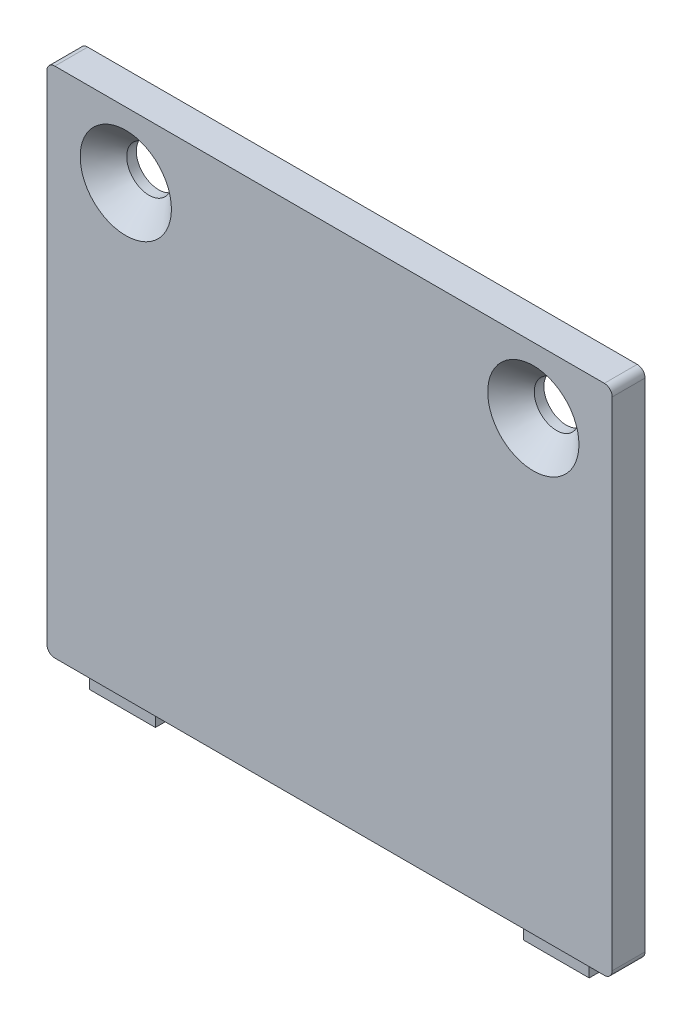
ISO-10303-21;
HEADER;
FILE_DESCRIPTION(('STEP AP214'),'2;1');
FILE_NAME('part.step','',(''),(''),'','','');
FILE_SCHEMA(('AUTOMOTIVE_DESIGN { 1 0 10303 214 1 1 1 1 }'));
ENDSEC;
DATA;
#1=APPLICATION_CONTEXT('core data for automotive mechanical design processes');
#2=APPLICATION_PROTOCOL_DEFINITION('international standard','automotive_design',2000,#1);
#3=PRODUCT_CONTEXT('',#1,'mechanical');
#4=PRODUCT('Part','Part','',(#3));
#5=PRODUCT_RELATED_PRODUCT_CATEGORY('part','',(#4));
#6=PRODUCT_DEFINITION_FORMATION('','',#4);
#7=PRODUCT_DEFINITION_CONTEXT('part definition',#1,'design');
#8=PRODUCT_DEFINITION('design','',#6,#7);
#9=PRODUCT_DEFINITION_SHAPE('','',#8);
#10=(LENGTH_UNIT() NAMED_UNIT(*) SI_UNIT(.MILLI.,.METRE.));
#11=(NAMED_UNIT(*) PLANE_ANGLE_UNIT() SI_UNIT($,.RADIAN.));
#12=(NAMED_UNIT(*) SI_UNIT($,.STERADIAN.) SOLID_ANGLE_UNIT());
#13=UNCERTAINTY_MEASURE_WITH_UNIT(LENGTH_MEASURE(1.E-05),#10,'distance_accuracy_value','');
#14=(GEOMETRIC_REPRESENTATION_CONTEXT(3) GLOBAL_UNCERTAINTY_ASSIGNED_CONTEXT((#13)) GLOBAL_UNIT_ASSIGNED_CONTEXT((#10,
#11,#12)) REPRESENTATION_CONTEXT('',''));
#15=CARTESIAN_POINT('',(0.,0.,0.));
#16=DIRECTION('',(0.,0.,1.));
#17=DIRECTION('',(1.,0.,0.));
#18=AXIS2_PLACEMENT_3D('',#15,#16,#17);
#19=CARTESIAN_POINT('',(-21.5,-19.5,2.5));
#20=DIRECTION('',(0.,1.,0.));
#21=DIRECTION('',(0.,0.,1.));
#22=AXIS2_PLACEMENT_3D('',#19,#20,#21);
#23=PLANE('',#22);
#24=DIRECTION('',(0.,0.,1.));
#25=VECTOR('',#24,1.);
#26=CARTESIAN_POINT('',(-14.,-19.5,0.75));
#27=LINE('',#26,#25);
#28=CARTESIAN_POINT('',(-14.,-19.5,0.75));
#29=VERTEX_POINT('',#28);
#30=CARTESIAN_POINT('',(-14.,-19.5,1.75));
#31=VERTEX_POINT('',#30);
#32=EDGE_CURVE('E177',#29,#31,#27,.T.);
#33=ORIENTED_EDGE('',*,*,#32,.F.);
#34=DIRECTION('',(1.,0.,0.));
#35=VECTOR('',#34,1.);
#36=CARTESIAN_POINT('',(-19.,-19.5,0.75));
#37=LINE('',#36,#35);
#38=CARTESIAN_POINT('',(-19.,-19.5,0.75));
#39=VERTEX_POINT('',#38);
#40=EDGE_CURVE('E190',#39,#29,#37,.T.);
#41=ORIENTED_EDGE('',*,*,#40,.F.);
#42=DIRECTION('',(0.,0.,-1.));
#43=VECTOR('',#42,1.);
#44=CARTESIAN_POINT('',(-19.,-19.5,0.75));
#45=LINE('',#44,#43);
#46=CARTESIAN_POINT('',(-19.,-19.5,1.75));
#47=VERTEX_POINT('',#46);
#48=EDGE_CURVE('E199',#47,#39,#45,.T.);
#49=ORIENTED_EDGE('',*,*,#48,.F.);
#50=DIRECTION('',(-1.,0.,0.));
#51=VECTOR('',#50,1.);
#52=CARTESIAN_POINT('',(-19.,-19.5,1.75));
#53=LINE('',#52,#51);
#54=EDGE_CURVE('E180',#31,#47,#53,.T.);
#55=ORIENTED_EDGE('',*,*,#54,.F.);
#56=EDGE_LOOP('',(#33,#41,#49,#55));
#57=FACE_BOUND('',#56,.T.);
#58=DIRECTION('',(1.,0.,0.));
#59=VECTOR('',#58,1.);
#60=CARTESIAN_POINT('',(-21.5,-19.5,0.));
#61=LINE('',#60,#59);
#62=CARTESIAN_POINT('',(-20.9,-19.5,0.));
#63=VERTEX_POINT('',#62);
#64=CARTESIAN_POINT('',(20.9,-19.5,0.));
#65=VERTEX_POINT('',#64);
#66=EDGE_CURVE('E233',#63,#65,#61,.T.);
#67=ORIENTED_EDGE('',*,*,#66,.T.);
#68=DIRECTION('',(0.,0.,-1.));
#69=VECTOR('',#68,1.);
#70=CARTESIAN_POINT('',(20.9,-19.5,2.5));
#71=LINE('',#70,#69);
#72=CARTESIAN_POINT('',(20.9,-19.5,2.5));
#73=VERTEX_POINT('',#72);
#74=EDGE_CURVE('E270',#65,#73,#71,.F.);
#75=ORIENTED_EDGE('',*,*,#74,.T.);
#76=DIRECTION('',(1.,0.,0.));
#77=VECTOR('',#76,1.);
#78=CARTESIAN_POINT('',(-21.5,-19.5,2.5));
#79=LINE('',#78,#77);
#80=CARTESIAN_POINT('',(-20.9,-19.5,2.5));
#81=VERTEX_POINT('',#80);
#82=EDGE_CURVE('E237',#81,#73,#79,.T.);
#83=ORIENTED_EDGE('',*,*,#82,.F.);
#84=DIRECTION('',(0.,0.,-1.));
#85=VECTOR('',#84,1.);
#86=CARTESIAN_POINT('',(-20.9,-19.5,2.5));
#87=LINE('',#86,#85);
#88=EDGE_CURVE('E267',#81,#63,#87,.T.);
#89=ORIENTED_EDGE('',*,*,#88,.T.);
#90=EDGE_LOOP('',(#67,#75,#83,#89));
#91=FACE_BOUND('',#90,.T.);
#92=DIRECTION('',(0.,0.,1.));
#93=VECTOR('',#92,1.);
#94=CARTESIAN_POINT('',(19.,-19.5,0.75));
#95=LINE('',#94,#93);
#96=CARTESIAN_POINT('',(19.,-19.5,0.75));
#97=VERTEX_POINT('',#96);
#98=CARTESIAN_POINT('',(19.,-19.5,1.75));
#99=VERTEX_POINT('',#98);
#100=EDGE_CURVE('E176',#97,#99,#95,.T.);
#101=ORIENTED_EDGE('',*,*,#100,.F.);
#102=DIRECTION('',(1.,0.,0.));
#103=VECTOR('',#102,1.);
#104=CARTESIAN_POINT('',(19.,-19.5,0.75));
#105=LINE('',#104,#103);
#106=CARTESIAN_POINT('',(14.,-19.5,0.75));
#107=VERTEX_POINT('',#106);
#108=EDGE_CURVE('E173',#107,#97,#105,.T.);
#109=ORIENTED_EDGE('',*,*,#108,.F.);
#110=DIRECTION('',(0.,0.,-1.));
#111=VECTOR('',#110,1.);
#112=CARTESIAN_POINT('',(14.,-19.5,0.75));
#113=LINE('',#112,#111);
#114=CARTESIAN_POINT('',(14.,-19.5,1.75));
#115=VERTEX_POINT('',#114);
#116=EDGE_CURVE('E553',#115,#107,#113,.T.);
#117=ORIENTED_EDGE('',*,*,#116,.F.);
#118=DIRECTION('',(-1.,0.,0.));
#119=VECTOR('',#118,1.);
#120=CARTESIAN_POINT('',(19.,-19.5,1.75));
#121=LINE('',#120,#119);
#122=EDGE_CURVE('E555',#99,#115,#121,.T.);
#123=ORIENTED_EDGE('',*,*,#122,.F.);
#124=EDGE_LOOP('',(#101,#109,#117,#123));
#125=FACE_BOUND('',#124,.T.);
#126=ADVANCED_FACE('F38',(#57,#91,#125),#23,.F.);
#127=CARTESIAN_POINT('',(21.5,19.5,2.5));
#128=DIRECTION('',(-1.,0.,0.));
#129=DIRECTION('',(0.,-1.,0.));
#130=AXIS2_PLACEMENT_3D('',#127,#128,#129);
#131=PLANE('',#130);
#132=DIRECTION('',(0.,1.,0.));
#133=VECTOR('',#132,1.);
#134=CARTESIAN_POINT('',(21.5,19.5,2.5));
#135=LINE('',#134,#133);
#136=CARTESIAN_POINT('',(21.5,-18.9,2.5));
#137=VERTEX_POINT('',#136);
#138=CARTESIAN_POINT('',(21.5,18.9,2.5));
#139=VERTEX_POINT('',#138);
#140=EDGE_CURVE('E229',#137,#139,#135,.T.);
#141=ORIENTED_EDGE('',*,*,#140,.F.);
#142=DIRECTION('',(0.,0.,-1.));
#143=VECTOR('',#142,1.);
#144=CARTESIAN_POINT('',(21.5,-18.9,2.5));
#145=LINE('',#144,#143);
#146=CARTESIAN_POINT('',(21.5,-18.9,0.));
#147=VERTEX_POINT('',#146);
#148=EDGE_CURVE('E256',#137,#147,#145,.T.);
#149=ORIENTED_EDGE('',*,*,#148,.T.);
#150=DIRECTION('',(0.,1.,0.));
#151=VECTOR('',#150,1.);
#152=CARTESIAN_POINT('',(21.5,19.5,0.));
#153=LINE('',#152,#151);
#154=CARTESIAN_POINT('',(21.5,18.9,0.));
#155=VERTEX_POINT('',#154);
#156=EDGE_CURVE('E241',#147,#155,#153,.T.);
#157=ORIENTED_EDGE('',*,*,#156,.T.);
#158=DIRECTION('',(0.,0.,-1.));
#159=VECTOR('',#158,1.);
#160=CARTESIAN_POINT('',(21.5,18.9,2.5));
#161=LINE('',#160,#159);
#162=EDGE_CURVE('E240',#155,#139,#161,.F.);
#163=ORIENTED_EDGE('',*,*,#162,.T.);
#164=EDGE_LOOP('',(#141,#149,#157,#163));
#165=FACE_BOUND('',#164,.T.);
#166=ADVANCED_FACE('F315',(#165),#131,.F.);
#167=CARTESIAN_POINT('',(-21.5,19.5,2.5));
#168=DIRECTION('',(0.,-1.,0.));
#169=DIRECTION('',(0.,0.,-1.));
#170=AXIS2_PLACEMENT_3D('',#167,#168,#169);
#171=PLANE('',#170);
#172=DIRECTION('',(-1.,0.,0.));
#173=VECTOR('',#172,1.);
#174=CARTESIAN_POINT('',(-21.5,19.5,0.));
#175=LINE('',#174,#173);
#176=CARTESIAN_POINT('',(20.9,19.5,0.));
#177=VERTEX_POINT('',#176);
#178=CARTESIAN_POINT('',(-20.9,19.5,0.));
#179=VERTEX_POINT('',#178);
#180=EDGE_CURVE('E244',#177,#179,#175,.T.);
#181=ORIENTED_EDGE('',*,*,#180,.T.);
#182=DIRECTION('',(0.,0.,-1.));
#183=VECTOR('',#182,1.);
#184=CARTESIAN_POINT('',(-20.9,19.5,2.5));
#185=LINE('',#184,#183);
#186=CARTESIAN_POINT('',(-20.9,19.5,2.5));
#187=VERTEX_POINT('',#186);
#188=EDGE_CURVE('E11',#179,#187,#185,.F.);
#189=ORIENTED_EDGE('',*,*,#188,.T.);
#190=DIRECTION('',(-1.,0.,0.));
#191=VECTOR('',#190,1.);
#192=CARTESIAN_POINT('',(-21.5,19.5,2.5));
#193=LINE('',#192,#191);
#194=CARTESIAN_POINT('',(20.9,19.5,2.5));
#195=VERTEX_POINT('',#194);
#196=EDGE_CURVE('E232',#195,#187,#193,.T.);
#197=ORIENTED_EDGE('',*,*,#196,.F.);
#198=DIRECTION('',(0.,0.,-1.));
#199=VECTOR('',#198,1.);
#200=CARTESIAN_POINT('',(20.9,19.5,2.5));
#201=LINE('',#200,#199);
#202=EDGE_CURVE('E46',#195,#177,#201,.T.);
#203=ORIENTED_EDGE('',*,*,#202,.T.);
#204=EDGE_LOOP('',(#181,#189,#197,#203));
#205=FACE_BOUND('',#204,.T.);
#206=ADVANCED_FACE('F287',(#205),#171,.F.);
#207=CARTESIAN_POINT('',(-21.5,19.5,2.5));
#208=DIRECTION('',(1.,0.,0.));
#209=DIRECTION('',(0.,1.,0.));
#210=AXIS2_PLACEMENT_3D('',#207,#208,#209);
#211=PLANE('',#210);
#212=DIRECTION('',(0.,-1.,0.));
#213=VECTOR('',#212,1.);
#214=CARTESIAN_POINT('',(-21.5,19.5,0.));
#215=LINE('',#214,#213);
#216=CARTESIAN_POINT('',(-21.5,18.9,0.));
#217=VERTEX_POINT('',#216);
#218=CARTESIAN_POINT('',(-21.5,-18.9,0.));
#219=VERTEX_POINT('',#218);
#220=EDGE_CURVE('E247',#217,#219,#215,.T.);
#221=ORIENTED_EDGE('',*,*,#220,.T.);
#222=DIRECTION('',(0.,0.,-1.));
#223=VECTOR('',#222,1.);
#224=CARTESIAN_POINT('',(-21.5,-18.9,2.5));
#225=LINE('',#224,#223);
#226=CARTESIAN_POINT('',(-21.5,-18.9,2.5));
#227=VERTEX_POINT('',#226);
#228=EDGE_CURVE('E53',#219,#227,#225,.F.);
#229=ORIENTED_EDGE('',*,*,#228,.T.);
#230=DIRECTION('',(0.,-1.,0.));
#231=VECTOR('',#230,1.);
#232=CARTESIAN_POINT('',(-21.5,19.5,2.5));
#233=LINE('',#232,#231);
#234=CARTESIAN_POINT('',(-21.5,18.9,2.5));
#235=VERTEX_POINT('',#234);
#236=EDGE_CURVE('E235',#235,#227,#233,.T.);
#237=ORIENTED_EDGE('',*,*,#236,.F.);
#238=DIRECTION('',(0.,0.,-1.));
#239=VECTOR('',#238,1.);
#240=CARTESIAN_POINT('',(-21.5,18.9,2.5));
#241=LINE('',#240,#239);
#242=EDGE_CURVE('E279',#235,#217,#241,.T.);
#243=ORIENTED_EDGE('',*,*,#242,.T.);
#244=EDGE_LOOP('',(#221,#229,#237,#243));
#245=FACE_BOUND('',#244,.T.);
#246=ADVANCED_FACE('F298',(#245),#211,.F.);
#247=CARTESIAN_POINT('',(0.,0.,2.5));
#248=DIRECTION('',(0.,0.,1.));
#249=DIRECTION('',(1.,0.,0.));
#250=AXIS2_PLACEMENT_3D('',#247,#248,#249);
#251=PLANE('',#250);
#252=CARTESIAN_POINT('',(-15.5,14.5,2.5));
#253=DIRECTION('',(0.,0.,1.));
#254=DIRECTION('',(1.,0.,0.));
#255=AXIS2_PLACEMENT_3D('',#252,#253,#254);
#256=CIRCLE('',#255,3.47);
#257=CARTESIAN_POINT('',(-12.03,14.5,2.5));
#258=VERTEX_POINT('',#257);
#259=EDGE_CURVE('E215',#258,#258,#256,.T.);
#260=ORIENTED_EDGE('',*,*,#259,.F.);
#261=EDGE_LOOP('',(#260));
#262=FACE_BOUND('',#261,.T.);
#263=CARTESIAN_POINT('',(15.5,14.5,2.5));
#264=DIRECTION('',(0.,0.,1.));
#265=DIRECTION('',(1.,0.,0.));
#266=AXIS2_PLACEMENT_3D('',#263,#264,#265);
#267=CIRCLE('',#266,3.47);
#268=CARTESIAN_POINT('',(18.97,14.5,2.5));
#269=VERTEX_POINT('',#268);
#270=EDGE_CURVE('E222',#269,#269,#267,.T.);
#271=ORIENTED_EDGE('',*,*,#270,.F.);
#272=EDGE_LOOP('',(#271));
#273=FACE_BOUND('',#272,.T.);
#274=ORIENTED_EDGE('',*,*,#82,.T.);
#275=CARTESIAN_POINT('',(20.9,-18.9,2.5));
#276=DIRECTION('',(0.,0.,1.));
#277=DIRECTION('',(1.,0.,0.));
#278=AXIS2_PLACEMENT_3D('',#275,#276,#277);
#279=CIRCLE('',#278,0.6);
#280=EDGE_CURVE('E277',#73,#137,#279,.T.);
#281=ORIENTED_EDGE('',*,*,#280,.T.);
#282=ORIENTED_EDGE('',*,*,#140,.T.);
#283=CARTESIAN_POINT('',(20.9,18.9,2.5));
#284=DIRECTION('',(0.,0.,1.));
#285=DIRECTION('',(1.,0.,0.));
#286=AXIS2_PLACEMENT_3D('',#283,#284,#285);
#287=CIRCLE('',#286,0.6);
#288=EDGE_CURVE('E272',#139,#195,#287,.T.);
#289=ORIENTED_EDGE('',*,*,#288,.T.);
#290=ORIENTED_EDGE('',*,*,#196,.T.);
#291=CARTESIAN_POINT('',(-20.9,18.9,2.5));
#292=DIRECTION('',(0.,0.,1.));
#293=DIRECTION('',(1.,0.,0.));
#294=AXIS2_PLACEMENT_3D('',#291,#292,#293);
#295=CIRCLE('',#294,0.6);
#296=EDGE_CURVE('E60',#187,#235,#295,.T.);
#297=ORIENTED_EDGE('',*,*,#296,.T.);
#298=ORIENTED_EDGE('',*,*,#236,.T.);
#299=CARTESIAN_POINT('',(-20.9,-18.9,2.5));
#300=DIRECTION('',(0.,0.,1.));
#301=DIRECTION('',(1.,0.,0.));
#302=AXIS2_PLACEMENT_3D('',#299,#300,#301);
#303=CIRCLE('',#302,0.6);
#304=EDGE_CURVE('E275',#227,#81,#303,.T.);
#305=ORIENTED_EDGE('',*,*,#304,.T.);
#306=EDGE_LOOP('',(#274,#281,#282,#289,#290,#297,#298,#305));
#307=FACE_BOUND('',#306,.T.);
#308=ADVANCED_FACE('F300',(#262,#273,#307),#251,.T.);
#309=CARTESIAN_POINT('',(0.,0.,0.));
#310=DIRECTION('',(0.,0.,1.));
#311=DIRECTION('',(1.,0.,0.));
#312=AXIS2_PLACEMENT_3D('',#309,#310,#311);
#313=PLANE('',#312);
#314=CARTESIAN_POINT('',(-15.5,14.5,0.));
#315=DIRECTION('',(0.,0.,1.));
#316=DIRECTION('',(1.,0.,0.));
#317=AXIS2_PLACEMENT_3D('',#314,#315,#316);
#318=CIRCLE('',#317,1.69999999999999);
#319=CARTESIAN_POINT('',(-13.8,14.5,0.));
#320=VERTEX_POINT('',#319);
#321=EDGE_CURVE('E221',#320,#320,#318,.T.);
#322=ORIENTED_EDGE('',*,*,#321,.T.);
#323=EDGE_LOOP('',(#322));
#324=FACE_BOUND('',#323,.T.);
#325=CARTESIAN_POINT('',(15.5,14.5,0.));
#326=DIRECTION('',(0.,0.,1.));
#327=DIRECTION('',(1.,0.,0.));
#328=AXIS2_PLACEMENT_3D('',#325,#326,#327);
#329=CIRCLE('',#328,1.69999999999999);
#330=CARTESIAN_POINT('',(17.2,14.5,0.));
#331=VERTEX_POINT('',#330);
#332=EDGE_CURVE('E228',#331,#331,#329,.T.);
#333=ORIENTED_EDGE('',*,*,#332,.T.);
#334=EDGE_LOOP('',(#333));
#335=FACE_BOUND('',#334,.T.);
#336=ORIENTED_EDGE('',*,*,#156,.F.);
#337=CARTESIAN_POINT('',(20.9,-18.9,0.));
#338=DIRECTION('',(0.,0.,1.));
#339=DIRECTION('',(1.,0.,0.));
#340=AXIS2_PLACEMENT_3D('',#337,#338,#339);
#341=CIRCLE('',#340,0.6);
#342=EDGE_CURVE('E265',#147,#65,#341,.F.);
#343=ORIENTED_EDGE('',*,*,#342,.T.);
#344=ORIENTED_EDGE('',*,*,#66,.F.);
#345=CARTESIAN_POINT('',(-20.9,-18.9,0.));
#346=DIRECTION('',(0.,0.,1.));
#347=DIRECTION('',(1.,0.,0.));
#348=AXIS2_PLACEMENT_3D('',#345,#346,#347);
#349=CIRCLE('',#348,0.6);
#350=EDGE_CURVE('E263',#63,#219,#349,.F.);
#351=ORIENTED_EDGE('',*,*,#350,.T.);
#352=ORIENTED_EDGE('',*,*,#220,.F.);
#353=CARTESIAN_POINT('',(-20.9,18.9,0.));
#354=DIRECTION('',(0.,0.,1.));
#355=DIRECTION('',(1.,0.,0.));
#356=AXIS2_PLACEMENT_3D('',#353,#354,#355);
#357=CIRCLE('',#356,0.6);
#358=EDGE_CURVE('E261',#217,#179,#357,.F.);
#359=ORIENTED_EDGE('',*,*,#358,.T.);
#360=ORIENTED_EDGE('',*,*,#180,.F.);
#361=CARTESIAN_POINT('',(20.9,18.9,0.));
#362=DIRECTION('',(0.,0.,1.));
#363=DIRECTION('',(1.,0.,0.));
#364=AXIS2_PLACEMENT_3D('',#361,#362,#363);
#365=CIRCLE('',#364,0.6);
#366=EDGE_CURVE('E259',#177,#155,#365,.F.);
#367=ORIENTED_EDGE('',*,*,#366,.T.);
#368=EDGE_LOOP('',(#336,#343,#344,#351,#352,#359,#360,#367));
#369=FACE_BOUND('',#368,.T.);
#370=ADVANCED_FACE('F293',(#324,#335,#369),#313,.F.);
#371=CARTESIAN_POINT('',(15.5,14.5,2.5));
#372=DIRECTION('',(0.,0.,1.));
#373=DIRECTION('',(1.,0.,0.));
#374=AXIS2_PLACEMENT_3D('',#371,#372,#373);
#375=CYLINDRICAL_SURFACE('',#374,1.69999999999999);
#376=CARTESIAN_POINT('',(15.5,14.5,0.729999999999992));
#377=DIRECTION('',(0.,0.,1.));
#378=DIRECTION('',(1.,0.,0.));
#379=AXIS2_PLACEMENT_3D('',#376,#377,#378);
#380=CIRCLE('',#379,1.69999999999999);
#381=CARTESIAN_POINT('',(17.2,14.5,0.729999999999992));
#382=VERTEX_POINT('',#381);
#383=EDGE_CURVE('E225',#382,#382,#380,.T.);
#384=ORIENTED_EDGE('',*,*,#383,.T.);
#385=EDGE_LOOP('',(#384));
#386=FACE_BOUND('',#385,.T.);
#387=ORIENTED_EDGE('',*,*,#332,.F.);
#388=EDGE_LOOP('',(#387));
#389=FACE_BOUND('',#388,.T.);
#390=ADVANCED_FACE('F475',(#386,#389),#375,.F.);
#391=CARTESIAN_POINT('',(15.5,14.5,2.5));
#392=DIRECTION('',(0.,0.,1.));
#393=DIRECTION('',(1.,0.,0.));
#394=AXIS2_PLACEMENT_3D('',#391,#392,#393);
#395=CONICAL_SURFACE('',#394,3.47,0.78539816339745);
#396=ORIENTED_EDGE('',*,*,#383,.F.);
#397=EDGE_LOOP('',(#396));
#398=FACE_BOUND('',#397,.T.);
#399=ORIENTED_EDGE('',*,*,#270,.T.);
#400=EDGE_LOOP('',(#399));
#401=FACE_BOUND('',#400,.T.);
#402=ADVANCED_FACE('F466',(#398,#401),#395,.F.);
#403=CARTESIAN_POINT('',(-15.5,14.5,2.5));
#404=DIRECTION('',(0.,0.,1.));
#405=DIRECTION('',(1.,0.,0.));
#406=AXIS2_PLACEMENT_3D('',#403,#404,#405);
#407=CYLINDRICAL_SURFACE('',#406,1.69999999999999);
#408=CARTESIAN_POINT('',(-15.5,14.5,0.729999999999992));
#409=DIRECTION('',(0.,0.,1.));
#410=DIRECTION('',(1.,0.,0.));
#411=AXIS2_PLACEMENT_3D('',#408,#409,#410);
#412=CIRCLE('',#411,1.69999999999999);
#413=CARTESIAN_POINT('',(-13.8,14.5,0.729999999999992));
#414=VERTEX_POINT('',#413);
#415=EDGE_CURVE('E218',#414,#414,#412,.T.);
#416=ORIENTED_EDGE('',*,*,#415,.T.);
#417=EDGE_LOOP('',(#416));
#418=FACE_BOUND('',#417,.T.);
#419=ORIENTED_EDGE('',*,*,#321,.F.);
#420=EDGE_LOOP('',(#419));
#421=FACE_BOUND('',#420,.T.);
#422=ADVANCED_FACE('F457',(#418,#421),#407,.F.);
#423=CARTESIAN_POINT('',(-15.5,14.5,2.5));
#424=DIRECTION('',(0.,0.,1.));
#425=DIRECTION('',(1.,0.,0.));
#426=AXIS2_PLACEMENT_3D('',#423,#424,#425);
#427=CONICAL_SURFACE('',#426,3.47,0.785398163397449);
#428=ORIENTED_EDGE('',*,*,#415,.F.);
#429=EDGE_LOOP('',(#428));
#430=FACE_BOUND('',#429,.T.);
#431=ORIENTED_EDGE('',*,*,#259,.T.);
#432=EDGE_LOOP('',(#431));
#433=FACE_BOUND('',#432,.T.);
#434=ADVANCED_FACE('F443',(#430,#433),#427,.F.);
#435=CARTESIAN_POINT('',(-14.,-21.,0.75));
#436=DIRECTION('',(-1.,0.,0.));
#437=DIRECTION('',(0.,0.,1.));
#438=AXIS2_PLACEMENT_3D('',#435,#436,#437);
#439=PLANE('',#438);
#440=ORIENTED_EDGE('',*,*,#32,.T.);
#441=DIRECTION('',(0.,1.,0.));
#442=VECTOR('',#441,1.);
#443=CARTESIAN_POINT('',(-14.,-21.,1.75));
#444=LINE('',#443,#442);
#445=CARTESIAN_POINT('',(-14.,-21.,1.75));
#446=VERTEX_POINT('',#445);
#447=EDGE_CURVE('E212',#446,#31,#444,.T.);
#448=ORIENTED_EDGE('',*,*,#447,.F.);
#449=DIRECTION('',(0.,0.,1.));
#450=VECTOR('',#449,1.);
#451=CARTESIAN_POINT('',(-14.,-21.,0.75));
#452=LINE('',#451,#450);
#453=CARTESIAN_POINT('',(-14.,-21.,0.75));
#454=VERTEX_POINT('',#453);
#455=EDGE_CURVE('E186',#454,#446,#452,.T.);
#456=ORIENTED_EDGE('',*,*,#455,.F.);
#457=DIRECTION('',(0.,1.,0.));
#458=VECTOR('',#457,1.);
#459=CARTESIAN_POINT('',(-14.,-21.,0.75));
#460=LINE('',#459,#458);
#461=EDGE_CURVE('E195',#454,#29,#460,.T.);
#462=ORIENTED_EDGE('',*,*,#461,.T.);
#463=EDGE_LOOP('',(#440,#448,#456,#462));
#464=FACE_BOUND('',#463,.T.);
#465=ADVANCED_FACE('F434',(#464),#439,.F.);
#466=CARTESIAN_POINT('',(-19.,-21.,1.75));
#467=DIRECTION('',(0.,0.,-1.));
#468=DIRECTION('',(-1.,0.,0.));
#469=AXIS2_PLACEMENT_3D('',#466,#467,#468);
#470=PLANE('',#469);
#471=ORIENTED_EDGE('',*,*,#54,.T.);
#472=DIRECTION('',(0.,1.,0.));
#473=VECTOR('',#472,1.);
#474=CARTESIAN_POINT('',(-19.,-21.,1.75));
#475=LINE('',#474,#473);
#476=CARTESIAN_POINT('',(-19.,-21.,1.75));
#477=VERTEX_POINT('',#476);
#478=EDGE_CURVE('E209',#477,#47,#475,.T.);
#479=ORIENTED_EDGE('',*,*,#478,.F.);
#480=DIRECTION('',(-1.,0.,0.));
#481=VECTOR('',#480,1.);
#482=CARTESIAN_POINT('',(-19.,-21.,1.75));
#483=LINE('',#482,#481);
#484=EDGE_CURVE('E189',#446,#477,#483,.T.);
#485=ORIENTED_EDGE('',*,*,#484,.F.);
#486=ORIENTED_EDGE('',*,*,#447,.T.);
#487=EDGE_LOOP('',(#471,#479,#485,#486));
#488=FACE_BOUND('',#487,.T.);
#489=ADVANCED_FACE('F425',(#488),#470,.F.);
#490=CARTESIAN_POINT('',(-19.,-21.,0.75));
#491=DIRECTION('',(1.,0.,0.));
#492=DIRECTION('',(0.,0.,-1.));
#493=AXIS2_PLACEMENT_3D('',#490,#491,#492);
#494=PLANE('',#493);
#495=ORIENTED_EDGE('',*,*,#48,.T.);
#496=DIRECTION('',(0.,1.,0.));
#497=VECTOR('',#496,1.);
#498=CARTESIAN_POINT('',(-19.,-21.,0.75));
#499=LINE('',#498,#497);
#500=CARTESIAN_POINT('',(-19.,-21.,0.75));
#501=VERTEX_POINT('',#500);
#502=EDGE_CURVE('E206',#501,#39,#499,.T.);
#503=ORIENTED_EDGE('',*,*,#502,.F.);
#504=DIRECTION('',(0.,0.,-1.));
#505=VECTOR('',#504,1.);
#506=CARTESIAN_POINT('',(-19.,-21.,0.75));
#507=LINE('',#506,#505);
#508=EDGE_CURVE('E192',#477,#501,#507,.T.);
#509=ORIENTED_EDGE('',*,*,#508,.F.);
#510=ORIENTED_EDGE('',*,*,#478,.T.);
#511=EDGE_LOOP('',(#495,#503,#509,#510));
#512=FACE_BOUND('',#511,.T.);
#513=ADVANCED_FACE('F416',(#512),#494,.F.);
#514=CARTESIAN_POINT('',(-19.,-21.,0.75));
#515=DIRECTION('',(0.,0.,1.));
#516=DIRECTION('',(1.,0.,0.));
#517=AXIS2_PLACEMENT_3D('',#514,#515,#516);
#518=PLANE('',#517);
#519=ORIENTED_EDGE('',*,*,#40,.T.);
#520=ORIENTED_EDGE('',*,*,#461,.F.);
#521=DIRECTION('',(1.,0.,0.));
#522=VECTOR('',#521,1.);
#523=CARTESIAN_POINT('',(-19.,-21.,0.75));
#524=LINE('',#523,#522);
#525=EDGE_CURVE('E194',#501,#454,#524,.T.);
#526=ORIENTED_EDGE('',*,*,#525,.F.);
#527=ORIENTED_EDGE('',*,*,#502,.T.);
#528=EDGE_LOOP('',(#519,#520,#526,#527));
#529=FACE_BOUND('',#528,.T.);
#530=ADVANCED_FACE('F407',(#529),#518,.F.);
#531=CARTESIAN_POINT('',(0.,-21.,0.));
#532=DIRECTION('',(0.,1.,0.));
#533=DIRECTION('',(0.,0.,1.));
#534=AXIS2_PLACEMENT_3D('',#531,#532,#533);
#535=PLANE('',#534);
#536=ORIENTED_EDGE('',*,*,#455,.T.);
#537=ORIENTED_EDGE('',*,*,#484,.T.);
#538=ORIENTED_EDGE('',*,*,#508,.T.);
#539=ORIENTED_EDGE('',*,*,#525,.T.);
#540=EDGE_LOOP('',(#536,#537,#538,#539));
#541=FACE_BOUND('',#540,.T.);
#542=ADVANCED_FACE('F399',(#541),#535,.F.);
#543=CARTESIAN_POINT('',(19.,-21.,0.75));
#544=DIRECTION('',(-1.,0.,0.));
#545=DIRECTION('',(0.,0.,1.));
#546=AXIS2_PLACEMENT_3D('',#543,#544,#545);
#547=PLANE('',#546);
#548=ORIENTED_EDGE('',*,*,#100,.T.);
#549=DIRECTION('',(0.,1.,0.));
#550=VECTOR('',#549,1.);
#551=CARTESIAN_POINT('',(19.,-21.,1.75));
#552=LINE('',#551,#550);
#553=CARTESIAN_POINT('',(19.,-21.,1.75));
#554=VERTEX_POINT('',#553);
#555=EDGE_CURVE('E157',#554,#99,#552,.T.);
#556=ORIENTED_EDGE('',*,*,#555,.F.);
#557=DIRECTION('',(0.,0.,1.));
#558=VECTOR('',#557,1.);
#559=CARTESIAN_POINT('',(19.,-21.,0.75));
#560=LINE('',#559,#558);
#561=CARTESIAN_POINT('',(19.,-21.,0.75));
#562=VERTEX_POINT('',#561);
#563=EDGE_CURVE('E164',#562,#554,#560,.T.);
#564=ORIENTED_EDGE('',*,*,#563,.F.);
#565=DIRECTION('',(0.,1.,0.));
#566=VECTOR('',#565,1.);
#567=CARTESIAN_POINT('',(19.,-21.,0.75));
#568=LINE('',#567,#566);
#569=EDGE_CURVE('E558',#562,#97,#568,.T.);
#570=ORIENTED_EDGE('',*,*,#569,.T.);
#571=EDGE_LOOP('',(#548,#556,#564,#570));
#572=FACE_BOUND('',#571,.T.);
#573=ADVANCED_FACE('F175',(#572),#547,.F.);
#574=CARTESIAN_POINT('',(19.,-21.,1.75));
#575=DIRECTION('',(0.,0.,-1.));
#576=DIRECTION('',(-1.,0.,0.));
#577=AXIS2_PLACEMENT_3D('',#574,#575,#576);
#578=PLANE('',#577);
#579=ORIENTED_EDGE('',*,*,#122,.T.);
#580=DIRECTION('',(0.,1.,0.));
#581=VECTOR('',#580,1.);
#582=CARTESIAN_POINT('',(14.,-21.,1.75));
#583=LINE('',#582,#581);
#584=CARTESIAN_POINT('',(14.,-21.,1.75));
#585=VERTEX_POINT('',#584);
#586=EDGE_CURVE('E160',#585,#115,#583,.T.);
#587=ORIENTED_EDGE('',*,*,#586,.F.);
#588=DIRECTION('',(-1.,0.,0.));
#589=VECTOR('',#588,1.);
#590=CARTESIAN_POINT('',(19.,-21.,1.75));
#591=LINE('',#590,#589);
#592=EDGE_CURVE('E152',#554,#585,#591,.T.);
#593=ORIENTED_EDGE('',*,*,#592,.F.);
#594=ORIENTED_EDGE('',*,*,#555,.T.);
#595=EDGE_LOOP('',(#579,#587,#593,#594));
#596=FACE_BOUND('',#595,.T.);
#597=ADVANCED_FACE('F155',(#596),#578,.F.);
#598=CARTESIAN_POINT('',(14.,-21.,0.75));
#599=DIRECTION('',(1.,0.,0.));
#600=DIRECTION('',(0.,0.,-1.));
#601=AXIS2_PLACEMENT_3D('',#598,#599,#600);
#602=PLANE('',#601);
#603=ORIENTED_EDGE('',*,*,#116,.T.);
#604=DIRECTION('',(0.,1.,0.));
#605=VECTOR('',#604,1.);
#606=CARTESIAN_POINT('',(14.,-21.,0.75));
#607=LINE('',#606,#605);
#608=CARTESIAN_POINT('',(14.,-21.,0.75));
#609=VERTEX_POINT('',#608);
#610=EDGE_CURVE('E182',#609,#107,#607,.T.);
#611=ORIENTED_EDGE('',*,*,#610,.F.);
#612=DIRECTION('',(0.,0.,-1.));
#613=VECTOR('',#612,1.);
#614=CARTESIAN_POINT('',(14.,-21.,0.75));
#615=LINE('',#614,#613);
#616=EDGE_CURVE('E163',#585,#609,#615,.T.);
#617=ORIENTED_EDGE('',*,*,#616,.F.);
#618=ORIENTED_EDGE('',*,*,#586,.T.);
#619=EDGE_LOOP('',(#603,#611,#617,#618));
#620=FACE_BOUND('',#619,.T.);
#621=ADVANCED_FACE('F375',(#620),#602,.F.);
#622=CARTESIAN_POINT('',(19.,-21.,0.75));
#623=DIRECTION('',(0.,0.,1.));
#624=DIRECTION('',(1.,0.,0.));
#625=AXIS2_PLACEMENT_3D('',#622,#623,#624);
#626=PLANE('',#625);
#627=ORIENTED_EDGE('',*,*,#108,.T.);
#628=ORIENTED_EDGE('',*,*,#569,.F.);
#629=DIRECTION('',(1.,0.,0.));
#630=VECTOR('',#629,1.);
#631=CARTESIAN_POINT('',(19.,-21.,0.75));
#632=LINE('',#631,#630);
#633=EDGE_CURVE('E169',#609,#562,#632,.T.);
#634=ORIENTED_EDGE('',*,*,#633,.F.);
#635=ORIENTED_EDGE('',*,*,#610,.T.);
#636=EDGE_LOOP('',(#627,#628,#634,#635));
#637=FACE_BOUND('',#636,.T.);
#638=ADVANCED_FACE('F367',(#637),#626,.F.);
#639=CARTESIAN_POINT('',(0.,-21.,0.));
#640=DIRECTION('',(0.,-1.,0.));
#641=DIRECTION('',(0.,0.,-1.));
#642=AXIS2_PLACEMENT_3D('',#639,#640,#641);
#643=PLANE('',#642);
#644=ORIENTED_EDGE('',*,*,#563,.T.);
#645=ORIENTED_EDGE('',*,*,#592,.T.);
#646=ORIENTED_EDGE('',*,*,#616,.T.);
#647=ORIENTED_EDGE('',*,*,#633,.T.);
#648=EDGE_LOOP('',(#644,#645,#646,#647));
#649=FACE_BOUND('',#648,.T.);
#650=ADVANCED_FACE('F167',(#649),#643,.T.);
#651=CARTESIAN_POINT('',(20.9,-18.9,2.5));
#652=DIRECTION('',(0.,0.,-1.));
#653=DIRECTION('',(-1.,0.,0.));
#654=AXIS2_PLACEMENT_3D('',#651,#652,#653);
#655=CYLINDRICAL_SURFACE('',#654,0.6);
#656=ORIENTED_EDGE('',*,*,#280,.F.);
#657=ORIENTED_EDGE('',*,*,#74,.F.);
#658=ORIENTED_EDGE('',*,*,#342,.F.);
#659=ORIENTED_EDGE('',*,*,#148,.F.);
#660=EDGE_LOOP('',(#656,#657,#658,#659));
#661=FACE_BOUND('',#660,.T.);
#662=ADVANCED_FACE('F312',(#661),#655,.T.);
#663=CARTESIAN_POINT('',(-20.9,-18.9,2.5));
#664=DIRECTION('',(0.,0.,-1.));
#665=DIRECTION('',(-1.,0.,0.));
#666=AXIS2_PLACEMENT_3D('',#663,#664,#665);
#667=CYLINDRICAL_SURFACE('',#666,0.6);
#668=ORIENTED_EDGE('',*,*,#304,.F.);
#669=ORIENTED_EDGE('',*,*,#228,.F.);
#670=ORIENTED_EDGE('',*,*,#350,.F.);
#671=ORIENTED_EDGE('',*,*,#88,.F.);
#672=EDGE_LOOP('',(#668,#669,#670,#671));
#673=FACE_BOUND('',#672,.T.);
#674=ADVANCED_FACE('F304',(#673),#667,.T.);
#675=CARTESIAN_POINT('',(-20.9,18.9,2.5));
#676=DIRECTION('',(0.,0.,-1.));
#677=DIRECTION('',(-1.,0.,0.));
#678=AXIS2_PLACEMENT_3D('',#675,#676,#677);
#679=CYLINDRICAL_SURFACE('',#678,0.6);
#680=ORIENTED_EDGE('',*,*,#296,.F.);
#681=ORIENTED_EDGE('',*,*,#188,.F.);
#682=ORIENTED_EDGE('',*,*,#358,.F.);
#683=ORIENTED_EDGE('',*,*,#242,.F.);
#684=EDGE_LOOP('',(#680,#681,#682,#683));
#685=FACE_BOUND('',#684,.T.);
#686=ADVANCED_FACE('F297',(#685),#679,.T.);
#687=CARTESIAN_POINT('',(20.9,18.9,2.5));
#688=DIRECTION('',(0.,0.,-1.));
#689=DIRECTION('',(-1.,0.,0.));
#690=AXIS2_PLACEMENT_3D('',#687,#688,#689);
#691=CYLINDRICAL_SURFACE('',#690,0.6);
#692=ORIENTED_EDGE('',*,*,#288,.F.);
#693=ORIENTED_EDGE('',*,*,#162,.F.);
#694=ORIENTED_EDGE('',*,*,#366,.F.);
#695=ORIENTED_EDGE('',*,*,#202,.F.);
#696=EDGE_LOOP('',(#692,#693,#694,#695));
#697=FACE_BOUND('',#696,.T.);
#698=ADVANCED_FACE('F40',(#697),#691,.T.);
#699=CLOSED_SHELL('',(#126,#166,#206,#246,#308,#370,#390,#402,#422,#434,#465,#489,#513,#530,
#542,#573,#597,#621,#638,#650,#662,#674,#686,#698));
#700=MANIFOLD_SOLID_BREP('B2',#699);
#701=ADVANCED_BREP_SHAPE_REPRESENTATION('',(#18,#700),#14);
#702=SHAPE_DEFINITION_REPRESENTATION(#9,#701);
ENDSEC;
END-ISO-10303-21;
